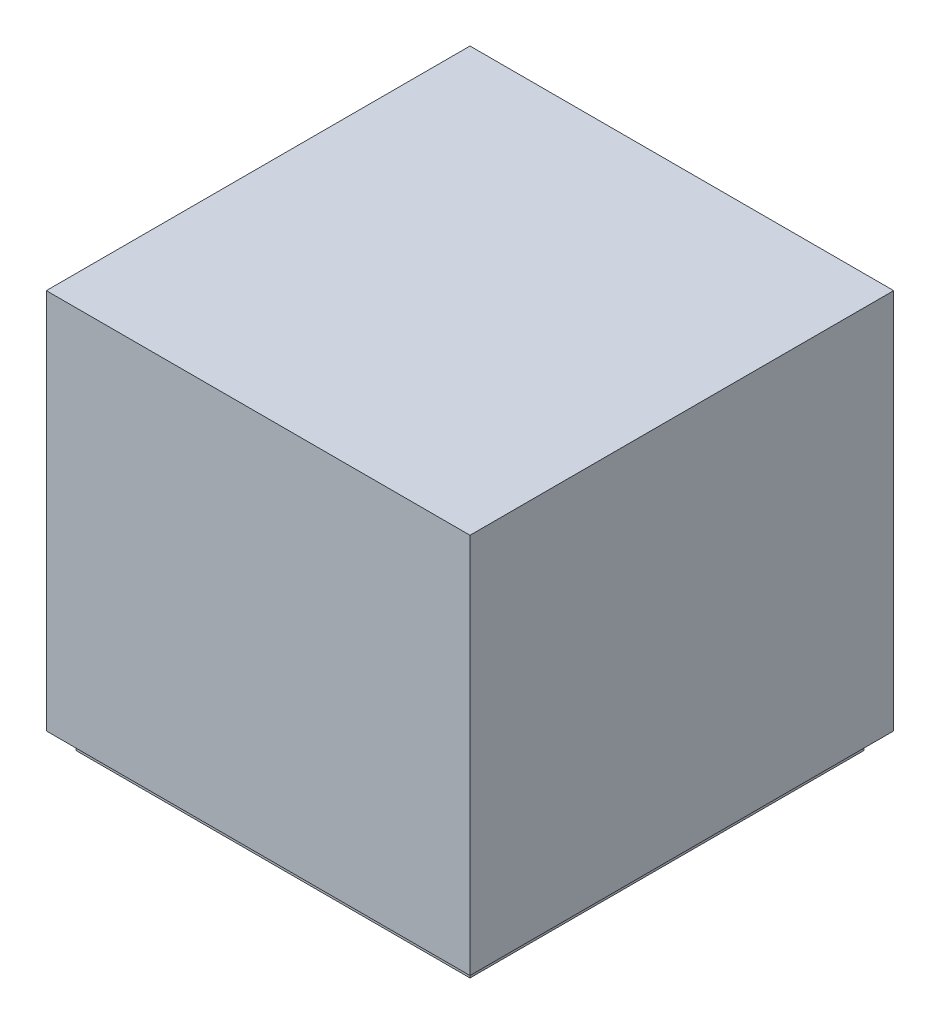
ISO-10303-21;
HEADER;
FILE_DESCRIPTION(('STEP AP214'),'2;1');
FILE_NAME('part.step','',(''),(''),'','','');
FILE_SCHEMA(('AUTOMOTIVE_DESIGN { 1 0 10303 214 1 1 1 1 }'));
ENDSEC;
DATA;
#1=APPLICATION_CONTEXT('core data for automotive mechanical design processes');
#2=APPLICATION_PROTOCOL_DEFINITION('international standard','automotive_design',2000,#1);
#3=PRODUCT_CONTEXT('',#1,'mechanical');
#4=PRODUCT('Part','Part','',(#3));
#5=PRODUCT_RELATED_PRODUCT_CATEGORY('part','',(#4));
#6=PRODUCT_DEFINITION_FORMATION('','',#4);
#7=PRODUCT_DEFINITION_CONTEXT('part definition',#1,'design');
#8=PRODUCT_DEFINITION('design','',#6,#7);
#9=PRODUCT_DEFINITION_SHAPE('','',#8);
#10=(LENGTH_UNIT() NAMED_UNIT(*) SI_UNIT(.MILLI.,.METRE.));
#11=(NAMED_UNIT(*) PLANE_ANGLE_UNIT() SI_UNIT($,.RADIAN.));
#12=(NAMED_UNIT(*) SI_UNIT($,.STERADIAN.) SOLID_ANGLE_UNIT());
#13=UNCERTAINTY_MEASURE_WITH_UNIT(LENGTH_MEASURE(1.E-05),#10,'distance_accuracy_value','');
#14=(GEOMETRIC_REPRESENTATION_CONTEXT(3) GLOBAL_UNCERTAINTY_ASSIGNED_CONTEXT((#13)) GLOBAL_UNIT_ASSIGNED_CONTEXT((#10,
#11,#12)) REPRESENTATION_CONTEXT('',''));
#15=CARTESIAN_POINT('',(0.,0.,0.));
#16=DIRECTION('',(0.,0.,1.));
#17=DIRECTION('',(1.,0.,0.));
#18=AXIS2_PLACEMENT_3D('',#15,#16,#17);
#19=CARTESIAN_POINT('',(-1.11022302462516E-13,900.,-500.));
#20=DIRECTION('',(0.,0.,1.));
#21=DIRECTION('',(1.,0.,0.));
#22=AXIS2_PLACEMENT_3D('',#19,#20,#21);
#23=PLANE('',#22);
#24=DIRECTION('',(-1.,0.,0.));
#25=VECTOR('',#24,1.);
#26=CARTESIAN_POINT('',(-1.11022302462516E-13,0.,-500.));
#27=LINE('',#26,#25);
#28=CARTESIAN_POINT('',(500.,0.,-500.));
#29=VERTEX_POINT('',#28);
#30=CARTESIAN_POINT('',(-500.,0.,-500.));
#31=VERTEX_POINT('',#30);
#32=EDGE_CURVE('E168',#29,#31,#27,.T.);
#33=ORIENTED_EDGE('',*,*,#32,.T.);
#34=DIRECTION('',(0.,-1.,0.));
#35=VECTOR('',#34,1.);
#36=CARTESIAN_POINT('',(-500.,900.,-500.));
#37=LINE('',#36,#35);
#38=CARTESIAN_POINT('',(-500.,900.,-500.));
#39=VERTEX_POINT('',#38);
#40=EDGE_CURVE('E11',#39,#31,#37,.T.);
#41=ORIENTED_EDGE('',*,*,#40,.F.);
#42=DIRECTION('',(-1.,0.,0.));
#43=VECTOR('',#42,1.);
#44=CARTESIAN_POINT('',(-1.11022302462516E-13,900.,-500.));
#45=LINE('',#44,#43);
#46=CARTESIAN_POINT('',(500.,900.,-500.));
#47=VERTEX_POINT('',#46);
#48=EDGE_CURVE('E161',#47,#39,#45,.T.);
#49=ORIENTED_EDGE('',*,*,#48,.F.);
#50=DIRECTION('',(0.,-1.,0.));
#51=VECTOR('',#50,1.);
#52=CARTESIAN_POINT('',(500.,900.,-500.));
#53=LINE('',#52,#51);
#54=EDGE_CURVE('E148',#47,#29,#53,.T.);
#55=ORIENTED_EDGE('',*,*,#54,.T.);
#56=EDGE_LOOP('',(#33,#41,#49,#55));
#57=FACE_BOUND('',#56,.T.);
#58=ADVANCED_FACE('F38',(#57),#23,.F.);
#59=CARTESIAN_POINT('',(-500.,900.,0.));
#60=DIRECTION('',(1.,0.,0.));
#61=DIRECTION('',(0.,0.,-1.));
#62=AXIS2_PLACEMENT_3D('',#59,#60,#61);
#63=PLANE('',#62);
#64=DIRECTION('',(0.,0.,1.));
#65=VECTOR('',#64,1.);
#66=CARTESIAN_POINT('',(-500.,0.,0.));
#67=LINE('',#66,#65);
#68=CARTESIAN_POINT('',(-500.,0.,500.));
#69=VERTEX_POINT('',#68);
#70=EDGE_CURVE('E165',#31,#69,#67,.T.);
#71=ORIENTED_EDGE('',*,*,#70,.T.);
#72=DIRECTION('',(0.,-1.,0.));
#73=VECTOR('',#72,1.);
#74=CARTESIAN_POINT('',(-500.,900.,500.));
#75=LINE('',#74,#73);
#76=CARTESIAN_POINT('',(-500.,900.,500.));
#77=VERTEX_POINT('',#76);
#78=EDGE_CURVE('E47',#77,#69,#75,.T.);
#79=ORIENTED_EDGE('',*,*,#78,.F.);
#80=DIRECTION('',(0.,0.,1.));
#81=VECTOR('',#80,1.);
#82=CARTESIAN_POINT('',(-500.,900.,0.));
#83=LINE('',#82,#81);
#84=EDGE_CURVE('E177',#39,#77,#83,.T.);
#85=ORIENTED_EDGE('',*,*,#84,.F.);
#86=ORIENTED_EDGE('',*,*,#40,.T.);
#87=EDGE_LOOP('',(#71,#79,#85,#86));
#88=FACE_BOUND('',#87,.T.);
#89=ADVANCED_FACE('F265',(#88),#63,.F.);
#90=CARTESIAN_POINT('',(0.,900.,500.));
#91=DIRECTION('',(0.,0.,1.));
#92=DIRECTION('',(1.,0.,0.));
#93=AXIS2_PLACEMENT_3D('',#90,#91,#92);
#94=PLANE('',#93);
#95=DIRECTION('',(-1.,0.,0.));
#96=VECTOR('',#95,1.);
#97=CARTESIAN_POINT('',(0.,0.,500.));
#98=LINE('',#97,#96);
#99=CARTESIAN_POINT('',(500.,0.,500.));
#100=VERTEX_POINT('',#99);
#101=EDGE_CURVE('E162',#100,#69,#98,.T.);
#102=ORIENTED_EDGE('',*,*,#101,.F.);
#103=DIRECTION('',(0.,-1.,0.));
#104=VECTOR('',#103,1.);
#105=CARTESIAN_POINT('',(500.,900.,500.));
#106=LINE('',#105,#104);
#107=CARTESIAN_POINT('',(500.,900.,500.));
#108=VERTEX_POINT('',#107);
#109=EDGE_CURVE('E155',#108,#100,#106,.T.);
#110=ORIENTED_EDGE('',*,*,#109,.F.);
#111=DIRECTION('',(-1.,0.,0.));
#112=VECTOR('',#111,1.);
#113=CARTESIAN_POINT('',(0.,900.,500.));
#114=LINE('',#113,#112);
#115=EDGE_CURVE('E174',#108,#77,#114,.T.);
#116=ORIENTED_EDGE('',*,*,#115,.T.);
#117=ORIENTED_EDGE('',*,*,#78,.T.);
#118=EDGE_LOOP('',(#102,#110,#116,#117));
#119=FACE_BOUND('',#118,.T.);
#120=ADVANCED_FACE('F262',(#119),#94,.T.);
#121=CARTESIAN_POINT('',(425.,900.,0.));
#122=DIRECTION('',(-1.,0.,0.));
#123=DIRECTION('',(0.,0.,1.));
#124=AXIS2_PLACEMENT_3D('',#121,#122,#123);
#125=PLANE('',#124);
#126=DIRECTION('',(0.,0.,1.));
#127=VECTOR('',#126,1.);
#128=CARTESIAN_POINT('',(425.,898.,0.));
#129=LINE('',#128,#127);
#130=CARTESIAN_POINT('',(425.,898.,-425.));
#131=VERTEX_POINT('',#130);
#132=CARTESIAN_POINT('',(425.,898.,425.));
#133=VERTEX_POINT('',#132);
#134=EDGE_CURVE('E131',#131,#133,#129,.T.);
#135=ORIENTED_EDGE('',*,*,#134,.F.);
#136=DIRECTION('',(0.,-1.,0.));
#137=VECTOR('',#136,1.);
#138=CARTESIAN_POINT('',(425.,900.,-425.));
#139=LINE('',#138,#137);
#140=CARTESIAN_POINT('',(425.,-40.,-425.));
#141=VERTEX_POINT('',#140);
#142=EDGE_CURVE('E149',#131,#141,#139,.T.);
#143=ORIENTED_EDGE('',*,*,#142,.T.);
#144=DIRECTION('',(0.,0.,-1.));
#145=VECTOR('',#144,1.);
#146=CARTESIAN_POINT('',(425.,-40.,0.));
#147=LINE('',#146,#145);
#148=CARTESIAN_POINT('',(425.,-40.,425.));
#149=VERTEX_POINT('',#148);
#150=EDGE_CURVE('E192',#149,#141,#147,.T.);
#151=ORIENTED_EDGE('',*,*,#150,.F.);
#152=DIRECTION('',(0.,-1.,0.));
#153=VECTOR('',#152,1.);
#154=CARTESIAN_POINT('',(425.,900.,425.));
#155=LINE('',#154,#153);
#156=EDGE_CURVE('E42',#133,#149,#155,.T.);
#157=ORIENTED_EDGE('',*,*,#156,.F.);
#158=EDGE_LOOP('',(#135,#143,#151,#157));
#159=FACE_BOUND('',#158,.T.);
#160=ADVANCED_FACE('F40',(#159),#125,.T.);
#161=CARTESIAN_POINT('',(0.,900.,425.));
#162=DIRECTION('',(0.,0.,-1.));
#163=DIRECTION('',(-1.,0.,0.));
#164=AXIS2_PLACEMENT_3D('',#161,#162,#163);
#165=PLANE('',#164);
#166=DIRECTION('',(-1.,0.,0.));
#167=VECTOR('',#166,1.);
#168=CARTESIAN_POINT('',(0.,898.,425.));
#169=LINE('',#168,#167);
#170=CARTESIAN_POINT('',(-425.,898.,425.));
#171=VERTEX_POINT('',#170);
#172=EDGE_CURVE('E128',#133,#171,#169,.T.);
#173=ORIENTED_EDGE('',*,*,#172,.F.);
#174=ORIENTED_EDGE('',*,*,#156,.T.);
#175=DIRECTION('',(1.,0.,0.));
#176=VECTOR('',#175,1.);
#177=CARTESIAN_POINT('',(0.,-40.,425.));
#178=LINE('',#177,#176);
#179=CARTESIAN_POINT('',(-425.,-40.,425.));
#180=VERTEX_POINT('',#179);
#181=EDGE_CURVE('E146',#180,#149,#178,.T.);
#182=ORIENTED_EDGE('',*,*,#181,.F.);
#183=DIRECTION('',(0.,-1.,0.));
#184=VECTOR('',#183,1.);
#185=CARTESIAN_POINT('',(-425.,900.,425.));
#186=LINE('',#185,#184);
#187=EDGE_CURVE('E140',#171,#180,#186,.T.);
#188=ORIENTED_EDGE('',*,*,#187,.F.);
#189=EDGE_LOOP('',(#173,#174,#182,#188));
#190=FACE_BOUND('',#189,.T.);
#191=ADVANCED_FACE('F144',(#190),#165,.T.);
#192=CARTESIAN_POINT('',(-425.,900.,0.));
#193=DIRECTION('',(-1.,0.,0.));
#194=DIRECTION('',(0.,0.,1.));
#195=AXIS2_PLACEMENT_3D('',#192,#193,#194);
#196=PLANE('',#195);
#197=DIRECTION('',(0.,-1.,0.));
#198=VECTOR('',#197,1.);
#199=CARTESIAN_POINT('',(-425.,900.,-425.));
#200=LINE('',#199,#198);
#201=CARTESIAN_POINT('',(-425.,898.,-425.));
#202=VERTEX_POINT('',#201);
#203=CARTESIAN_POINT('',(-425.,-40.,-425.));
#204=VERTEX_POINT('',#203);
#205=EDGE_CURVE('E142',#202,#204,#200,.T.);
#206=ORIENTED_EDGE('',*,*,#205,.F.);
#207=DIRECTION('',(0.,0.,1.));
#208=VECTOR('',#207,1.);
#209=CARTESIAN_POINT('',(-425.,898.,0.));
#210=LINE('',#209,#208);
#211=EDGE_CURVE('E55',#202,#171,#210,.T.);
#212=ORIENTED_EDGE('',*,*,#211,.T.);
#213=ORIENTED_EDGE('',*,*,#187,.T.);
#214=DIRECTION('',(0.,0.,-1.));
#215=VECTOR('',#214,1.);
#216=CARTESIAN_POINT('',(-425.,-40.,0.));
#217=LINE('',#216,#215);
#218=EDGE_CURVE('E214',#180,#204,#217,.T.);
#219=ORIENTED_EDGE('',*,*,#218,.T.);
#220=EDGE_LOOP('',(#206,#212,#213,#219));
#221=FACE_BOUND('',#220,.T.);
#222=ADVANCED_FACE('F138',(#221),#196,.F.);
#223=CARTESIAN_POINT('',(0.,900.,-425.));
#224=DIRECTION('',(0.,0.,-1.));
#225=DIRECTION('',(-1.,0.,0.));
#226=AXIS2_PLACEMENT_3D('',#223,#224,#225);
#227=PLANE('',#226);
#228=ORIENTED_EDGE('',*,*,#142,.F.);
#229=DIRECTION('',(-1.,0.,0.));
#230=VECTOR('',#229,1.);
#231=CARTESIAN_POINT('',(0.,898.,-425.));
#232=LINE('',#231,#230);
#233=EDGE_CURVE('E200',#131,#202,#232,.T.);
#234=ORIENTED_EDGE('',*,*,#233,.T.);
#235=ORIENTED_EDGE('',*,*,#205,.T.);
#236=DIRECTION('',(1.,0.,0.));
#237=VECTOR('',#236,1.);
#238=CARTESIAN_POINT('',(0.,-40.,-425.));
#239=LINE('',#238,#237);
#240=EDGE_CURVE('E211',#204,#141,#239,.T.);
#241=ORIENTED_EDGE('',*,*,#240,.T.);
#242=EDGE_LOOP('',(#228,#234,#235,#241));
#243=FACE_BOUND('',#242,.T.);
#244=ADVANCED_FACE('F222',(#243),#227,.F.);
#245=CARTESIAN_POINT('',(500.,900.,0.));
#246=DIRECTION('',(1.,0.,0.));
#247=DIRECTION('',(0.,0.,-1.));
#248=AXIS2_PLACEMENT_3D('',#245,#246,#247);
#249=PLANE('',#248);
#250=DIRECTION('',(0.,0.,1.));
#251=VECTOR('',#250,1.);
#252=CARTESIAN_POINT('',(500.,0.,0.));
#253=LINE('',#252,#251);
#254=EDGE_CURVE('E158',#29,#100,#253,.T.);
#255=ORIENTED_EDGE('',*,*,#254,.F.);
#256=ORIENTED_EDGE('',*,*,#54,.F.);
#257=DIRECTION('',(0.,0.,1.));
#258=VECTOR('',#257,1.);
#259=CARTESIAN_POINT('',(500.,900.,0.));
#260=LINE('',#259,#258);
#261=EDGE_CURVE('E152',#47,#108,#260,.T.);
#262=ORIENTED_EDGE('',*,*,#261,.T.);
#263=ORIENTED_EDGE('',*,*,#109,.T.);
#264=EDGE_LOOP('',(#255,#256,#262,#263));
#265=FACE_BOUND('',#264,.T.);
#266=ADVANCED_FACE('F256',(#265),#249,.T.);
#267=CARTESIAN_POINT('',(0.,900.,0.));
#268=DIRECTION('',(0.,1.,0.));
#269=DIRECTION('',(0.,0.,1.));
#270=AXIS2_PLACEMENT_3D('',#267,#268,#269);
#271=PLANE('',#270);
#272=ORIENTED_EDGE('',*,*,#48,.T.);
#273=ORIENTED_EDGE('',*,*,#84,.T.);
#274=ORIENTED_EDGE('',*,*,#115,.F.);
#275=ORIENTED_EDGE('',*,*,#261,.F.);
#276=EDGE_LOOP('',(#272,#273,#274,#275));
#277=FACE_BOUND('',#276,.T.);
#278=ADVANCED_FACE('F249',(#277),#271,.T.);
#279=CARTESIAN_POINT('',(0.,0.,0.));
#280=DIRECTION('',(0.,1.,0.));
#281=DIRECTION('',(0.,0.,1.));
#282=AXIS2_PLACEMENT_3D('',#279,#280,#281);
#283=PLANE('',#282);
#284=DIRECTION('',(0.,0.,-1.));
#285=VECTOR('',#284,1.);
#286=CARTESIAN_POINT('',(-465.,0.,0.));
#287=LINE('',#286,#285);
#288=CARTESIAN_POINT('',(-465.,0.,465.));
#289=VERTEX_POINT('',#288);
#290=CARTESIAN_POINT('',(-465.,0.,-465.));
#291=VERTEX_POINT('',#290);
#292=EDGE_CURVE('E189',#289,#291,#287,.T.);
#293=ORIENTED_EDGE('',*,*,#292,.F.);
#294=DIRECTION('',(1.,0.,0.));
#295=VECTOR('',#294,1.);
#296=CARTESIAN_POINT('',(0.,0.,465.));
#297=LINE('',#296,#295);
#298=CARTESIAN_POINT('',(465.,0.,465.));
#299=VERTEX_POINT('',#298);
#300=EDGE_CURVE('E197',#289,#299,#297,.T.);
#301=ORIENTED_EDGE('',*,*,#300,.T.);
#302=DIRECTION('',(0.,0.,-1.));
#303=VECTOR('',#302,1.);
#304=CARTESIAN_POINT('',(465.,0.,0.));
#305=LINE('',#304,#303);
#306=CARTESIAN_POINT('',(465.,0.,-465.));
#307=VERTEX_POINT('',#306);
#308=EDGE_CURVE('E194',#299,#307,#305,.T.);
#309=ORIENTED_EDGE('',*,*,#308,.T.);
#310=DIRECTION('',(1.,0.,0.));
#311=VECTOR('',#310,1.);
#312=CARTESIAN_POINT('',(0.,0.,-465.));
#313=LINE('',#312,#311);
#314=EDGE_CURVE('E63',#291,#307,#313,.T.);
#315=ORIENTED_EDGE('',*,*,#314,.F.);
#316=EDGE_LOOP('',(#293,#301,#309,#315));
#317=FACE_BOUND('',#316,.T.);
#318=ORIENTED_EDGE('',*,*,#32,.F.);
#319=ORIENTED_EDGE('',*,*,#254,.T.);
#320=ORIENTED_EDGE('',*,*,#101,.T.);
#321=ORIENTED_EDGE('',*,*,#70,.F.);
#322=EDGE_LOOP('',(#318,#319,#320,#321));
#323=FACE_BOUND('',#322,.T.);
#324=ADVANCED_FACE('F246',(#317,#323),#283,.F.);
#325=CARTESIAN_POINT('',(0.,-40.,465.));
#326=DIRECTION('',(0.,0.,1.));
#327=DIRECTION('',(1.,0.,0.));
#328=AXIS2_PLACEMENT_3D('',#325,#326,#327);
#329=PLANE('',#328);
#330=ORIENTED_EDGE('',*,*,#300,.F.);
#331=DIRECTION('',(0.,1.,0.));
#332=VECTOR('',#331,1.);
#333=CARTESIAN_POINT('',(-465.,-40.,465.));
#334=LINE('',#333,#332);
#335=CARTESIAN_POINT('',(-465.,-40.,465.));
#336=VERTEX_POINT('',#335);
#337=EDGE_CURVE('E171',#336,#289,#334,.T.);
#338=ORIENTED_EDGE('',*,*,#337,.F.);
#339=DIRECTION('',(1.,0.,0.));
#340=VECTOR('',#339,1.);
#341=CARTESIAN_POINT('',(0.,-40.,465.));
#342=LINE('',#341,#340);
#343=CARTESIAN_POINT('',(465.,-40.,465.));
#344=VERTEX_POINT('',#343);
#345=EDGE_CURVE('E208',#336,#344,#342,.T.);
#346=ORIENTED_EDGE('',*,*,#345,.T.);
#347=DIRECTION('',(0.,1.,0.));
#348=VECTOR('',#347,1.);
#349=CARTESIAN_POINT('',(465.,-40.,465.));
#350=LINE('',#349,#348);
#351=EDGE_CURVE('E181',#344,#299,#350,.T.);
#352=ORIENTED_EDGE('',*,*,#351,.T.);
#353=EDGE_LOOP('',(#330,#338,#346,#352));
#354=FACE_BOUND('',#353,.T.);
#355=ADVANCED_FACE('F238',(#354),#329,.T.);
#356=CARTESIAN_POINT('',(-465.,-40.,0.));
#357=DIRECTION('',(1.,0.,0.));
#358=DIRECTION('',(0.,0.,-1.));
#359=AXIS2_PLACEMENT_3D('',#356,#357,#358);
#360=PLANE('',#359);
#361=ORIENTED_EDGE('',*,*,#292,.T.);
#362=DIRECTION('',(0.,1.,0.));
#363=VECTOR('',#362,1.);
#364=CARTESIAN_POINT('',(-465.,-40.,-465.));
#365=LINE('',#364,#363);
#366=CARTESIAN_POINT('',(-465.,-40.,-465.));
#367=VERTEX_POINT('',#366);
#368=EDGE_CURVE('E186',#367,#291,#365,.T.);
#369=ORIENTED_EDGE('',*,*,#368,.F.);
#370=DIRECTION('',(0.,0.,-1.));
#371=VECTOR('',#370,1.);
#372=CARTESIAN_POINT('',(-465.,-40.,0.));
#373=LINE('',#372,#371);
#374=EDGE_CURVE('E184',#336,#367,#373,.T.);
#375=ORIENTED_EDGE('',*,*,#374,.F.);
#376=ORIENTED_EDGE('',*,*,#337,.T.);
#377=EDGE_LOOP('',(#361,#369,#375,#376));
#378=FACE_BOUND('',#377,.T.);
#379=ADVANCED_FACE('F242',(#378),#360,.F.);
#380=CARTESIAN_POINT('',(0.,-40.,-465.));
#381=DIRECTION('',(0.,0.,1.));
#382=DIRECTION('',(1.,0.,0.));
#383=AXIS2_PLACEMENT_3D('',#380,#381,#382);
#384=PLANE('',#383);
#385=ORIENTED_EDGE('',*,*,#314,.T.);
#386=DIRECTION('',(0.,1.,0.));
#387=VECTOR('',#386,1.);
#388=CARTESIAN_POINT('',(465.,-40.,-465.));
#389=LINE('',#388,#387);
#390=CARTESIAN_POINT('',(465.,-40.,-465.));
#391=VERTEX_POINT('',#390);
#392=EDGE_CURVE('E183',#391,#307,#389,.T.);
#393=ORIENTED_EDGE('',*,*,#392,.F.);
#394=DIRECTION('',(1.,0.,0.));
#395=VECTOR('',#394,1.);
#396=CARTESIAN_POINT('',(0.,-40.,-465.));
#397=LINE('',#396,#395);
#398=EDGE_CURVE('E203',#367,#391,#397,.T.);
#399=ORIENTED_EDGE('',*,*,#398,.F.);
#400=ORIENTED_EDGE('',*,*,#368,.T.);
#401=EDGE_LOOP('',(#385,#393,#399,#400));
#402=FACE_BOUND('',#401,.T.);
#403=ADVANCED_FACE('F243',(#402),#384,.F.);
#404=CARTESIAN_POINT('',(465.,-40.,0.));
#405=DIRECTION('',(1.,0.,0.));
#406=DIRECTION('',(0.,0.,-1.));
#407=AXIS2_PLACEMENT_3D('',#404,#405,#406);
#408=PLANE('',#407);
#409=ORIENTED_EDGE('',*,*,#308,.F.);
#410=ORIENTED_EDGE('',*,*,#351,.F.);
#411=DIRECTION('',(0.,0.,-1.));
#412=VECTOR('',#411,1.);
#413=CARTESIAN_POINT('',(465.,-40.,0.));
#414=LINE('',#413,#412);
#415=EDGE_CURVE('E205',#344,#391,#414,.T.);
#416=ORIENTED_EDGE('',*,*,#415,.T.);
#417=ORIENTED_EDGE('',*,*,#392,.T.);
#418=EDGE_LOOP('',(#409,#410,#416,#417));
#419=FACE_BOUND('',#418,.T.);
#420=ADVANCED_FACE('F230',(#419),#408,.T.);
#421=CARTESIAN_POINT('',(0.,-40.,0.));
#422=DIRECTION('',(0.,1.,0.));
#423=DIRECTION('',(0.,0.,1.));
#424=AXIS2_PLACEMENT_3D('',#421,#422,#423);
#425=PLANE('',#424);
#426=ORIENTED_EDGE('',*,*,#150,.T.);
#427=ORIENTED_EDGE('',*,*,#240,.F.);
#428=ORIENTED_EDGE('',*,*,#218,.F.);
#429=ORIENTED_EDGE('',*,*,#181,.T.);
#430=EDGE_LOOP('',(#426,#427,#428,#429));
#431=FACE_BOUND('',#430,.T.);
#432=ORIENTED_EDGE('',*,*,#345,.F.);
#433=ORIENTED_EDGE('',*,*,#374,.T.);
#434=ORIENTED_EDGE('',*,*,#398,.T.);
#435=ORIENTED_EDGE('',*,*,#415,.F.);
#436=EDGE_LOOP('',(#432,#433,#434,#435));
#437=FACE_BOUND('',#436,.T.);
#438=ADVANCED_FACE('F226',(#431,#437),#425,.F.);
#439=CARTESIAN_POINT('',(0.,898.,0.));
#440=DIRECTION('',(0.,-1.,0.));
#441=DIRECTION('',(0.,0.,-1.));
#442=AXIS2_PLACEMENT_3D('',#439,#440,#441);
#443=PLANE('',#442);
#444=ORIENTED_EDGE('',*,*,#211,.F.);
#445=ORIENTED_EDGE('',*,*,#233,.F.);
#446=ORIENTED_EDGE('',*,*,#134,.T.);
#447=ORIENTED_EDGE('',*,*,#172,.T.);
#448=EDGE_LOOP('',(#444,#445,#446,#447));
#449=FACE_BOUND('',#448,.T.);
#450=ADVANCED_FACE('F129',(#449),#443,.T.);
#451=CLOSED_SHELL('',(#58,#89,#120,#160,#191,#222,#244,#266,#278,#324,#355,#379,#403,#420,#438,#450));
#452=MANIFOLD_SOLID_BREP('B2',#451);
#453=ADVANCED_BREP_SHAPE_REPRESENTATION('',(#18,#452),#14);
#454=SHAPE_DEFINITION_REPRESENTATION(#9,#453);
ENDSEC;
END-ISO-10303-21;
